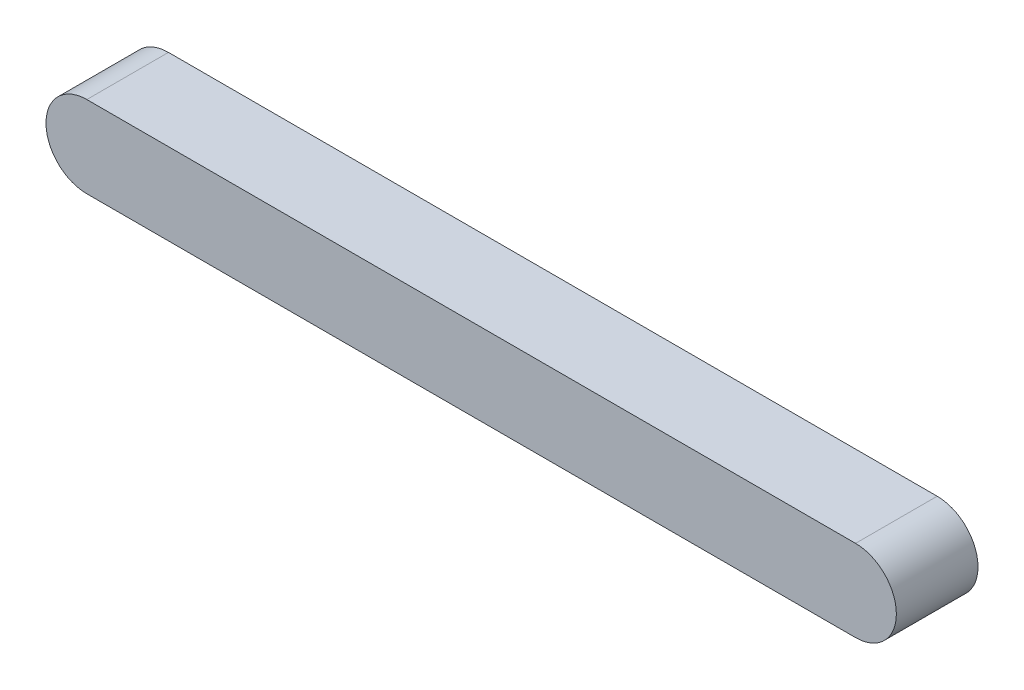
ISO-10303-21;
HEADER;
FILE_DESCRIPTION(('STEP AP214'),'2;1');
FILE_NAME('part.step','',(''),(''),'','','');
FILE_SCHEMA(('AUTOMOTIVE_DESIGN { 1 0 10303 214 1 1 1 1 }'));
ENDSEC;
DATA;
#1=APPLICATION_CONTEXT('core data for automotive mechanical design processes');
#2=APPLICATION_PROTOCOL_DEFINITION('international standard','automotive_design',2000,#1);
#3=PRODUCT_CONTEXT('',#1,'mechanical');
#4=PRODUCT('Part','Part','',(#3));
#5=PRODUCT_RELATED_PRODUCT_CATEGORY('part','',(#4));
#6=PRODUCT_DEFINITION_FORMATION('','',#4);
#7=PRODUCT_DEFINITION_CONTEXT('part definition',#1,'design');
#8=PRODUCT_DEFINITION('design','',#6,#7);
#9=PRODUCT_DEFINITION_SHAPE('','',#8);
#10=(LENGTH_UNIT() NAMED_UNIT(*) SI_UNIT(.MILLI.,.METRE.));
#11=(NAMED_UNIT(*) PLANE_ANGLE_UNIT() SI_UNIT($,.RADIAN.));
#12=(NAMED_UNIT(*) SI_UNIT($,.STERADIAN.) SOLID_ANGLE_UNIT());
#13=UNCERTAINTY_MEASURE_WITH_UNIT(LENGTH_MEASURE(1.E-05),#10,'distance_accuracy_value','');
#14=(GEOMETRIC_REPRESENTATION_CONTEXT(3) GLOBAL_UNCERTAINTY_ASSIGNED_CONTEXT((#13)) GLOBAL_UNIT_ASSIGNED_CONTEXT((#10,
#11,#12)) REPRESENTATION_CONTEXT('',''));
#15=CARTESIAN_POINT('',(0.,0.,0.));
#16=DIRECTION('',(0.,0.,1.));
#17=DIRECTION('',(1.,0.,0.));
#18=AXIS2_PLACEMENT_3D('',#15,#16,#17);
#19=CARTESIAN_POINT('',(-56.5,0.,12.));
#20=DIRECTION('',(0.,0.,-1.));
#21=DIRECTION('',(-1.,0.,0.));
#22=AXIS2_PLACEMENT_3D('',#19,#20,#21);
#23=CYLINDRICAL_SURFACE('',#22,5.99999999999996);
#24=CARTESIAN_POINT('',(-56.5,0.,0.));
#25=DIRECTION('',(0.,0.,1.));
#26=DIRECTION('',(1.,0.,0.));
#27=AXIS2_PLACEMENT_3D('',#24,#25,#26);
#28=CIRCLE('',#27,5.99999999999996);
#29=CARTESIAN_POINT('',(-56.5,5.99999999999996,0.));
#30=VERTEX_POINT('',#29);
#31=CARTESIAN_POINT('',(-56.5,-5.99999999999996,0.));
#32=VERTEX_POINT('',#31);
#33=EDGE_CURVE('E100',#30,#32,#28,.T.);
#34=ORIENTED_EDGE('',*,*,#33,.T.);
#35=DIRECTION('',(0.,0.,-1.));
#36=VECTOR('',#35,1.);
#37=CARTESIAN_POINT('',(-56.5,-5.99999999999996,12.));
#38=LINE('',#37,#36);
#39=CARTESIAN_POINT('',(-56.5,-5.99999999999996,12.));
#40=VERTEX_POINT('',#39);
#41=EDGE_CURVE('E11',#40,#32,#38,.T.);
#42=ORIENTED_EDGE('',*,*,#41,.F.);
#43=CARTESIAN_POINT('',(-56.5,0.,12.));
#44=DIRECTION('',(0.,0.,1.));
#45=DIRECTION('',(1.,0.,0.));
#46=AXIS2_PLACEMENT_3D('',#43,#44,#45);
#47=CIRCLE('',#46,5.99999999999996);
#48=CARTESIAN_POINT('',(-56.5,5.99999999999996,12.));
#49=VERTEX_POINT('',#48);
#50=EDGE_CURVE('E88',#49,#40,#47,.T.);
#51=ORIENTED_EDGE('',*,*,#50,.F.);
#52=DIRECTION('',(0.,0.,-1.));
#53=VECTOR('',#52,1.);
#54=CARTESIAN_POINT('',(-56.5,5.99999999999996,12.));
#55=LINE('',#54,#53);
#56=EDGE_CURVE('E96',#49,#30,#55,.T.);
#57=ORIENTED_EDGE('',*,*,#56,.T.);
#58=EDGE_LOOP('',(#34,#42,#51,#57));
#59=FACE_BOUND('',#58,.T.);
#60=ADVANCED_FACE('F37',(#59),#23,.T.);
#61=CARTESIAN_POINT('',(-56.5,-5.99999999999996,12.));
#62=DIRECTION('',(0.,1.,0.));
#63=DIRECTION('',(-1.,0.,0.));
#64=AXIS2_PLACEMENT_3D('',#61,#62,#63);
#65=PLANE('',#64);
#66=DIRECTION('',(1.,0.,0.));
#67=VECTOR('',#66,1.);
#68=CARTESIAN_POINT('',(-56.5,-5.99999999999996,0.));
#69=LINE('',#68,#67);
#70=CARTESIAN_POINT('',(56.5,-5.99999999999996,0.));
#71=VERTEX_POINT('',#70);
#72=EDGE_CURVE('E92',#32,#71,#69,.T.);
#73=ORIENTED_EDGE('',*,*,#72,.T.);
#74=DIRECTION('',(0.,0.,-1.));
#75=VECTOR('',#74,1.);
#76=CARTESIAN_POINT('',(56.5,-5.99999999999996,12.));
#77=LINE('',#76,#75);
#78=CARTESIAN_POINT('',(56.5,-5.99999999999996,12.));
#79=VERTEX_POINT('',#78);
#80=EDGE_CURVE('E45',#79,#71,#77,.T.);
#81=ORIENTED_EDGE('',*,*,#80,.F.);
#82=DIRECTION('',(1.,0.,0.));
#83=VECTOR('',#82,1.);
#84=CARTESIAN_POINT('',(-56.5,-5.99999999999996,12.));
#85=LINE('',#84,#83);
#86=EDGE_CURVE('E83',#40,#79,#85,.T.);
#87=ORIENTED_EDGE('',*,*,#86,.F.);
#88=ORIENTED_EDGE('',*,*,#41,.T.);
#89=EDGE_LOOP('',(#73,#81,#87,#88));
#90=FACE_BOUND('',#89,.T.);
#91=ADVANCED_FACE('F91',(#90),#65,.F.);
#92=CARTESIAN_POINT('',(56.5,0.,12.));
#93=DIRECTION('',(0.,0.,-1.));
#94=DIRECTION('',(-1.,0.,0.));
#95=AXIS2_PLACEMENT_3D('',#92,#93,#94);
#96=CYLINDRICAL_SURFACE('',#95,5.99999999999996);
#97=CARTESIAN_POINT('',(56.5,0.,0.));
#98=DIRECTION('',(0.,0.,1.));
#99=DIRECTION('',(1.,0.,0.));
#100=AXIS2_PLACEMENT_3D('',#97,#98,#99);
#101=CIRCLE('',#100,5.99999999999996);
#102=CARTESIAN_POINT('',(56.5,5.99999999999998,0.));
#103=VERTEX_POINT('',#102);
#104=EDGE_CURVE('E70',#71,#103,#101,.T.);
#105=ORIENTED_EDGE('',*,*,#104,.T.);
#106=DIRECTION('',(0.,0.,-1.));
#107=VECTOR('',#106,1.);
#108=CARTESIAN_POINT('',(56.5,5.99999999999998,12.));
#109=LINE('',#108,#107);
#110=CARTESIAN_POINT('',(56.5,5.99999999999998,12.));
#111=VERTEX_POINT('',#110);
#112=EDGE_CURVE('E93',#111,#103,#109,.T.);
#113=ORIENTED_EDGE('',*,*,#112,.F.);
#114=CARTESIAN_POINT('',(56.5,0.,12.));
#115=DIRECTION('',(0.,0.,1.));
#116=DIRECTION('',(1.,0.,0.));
#117=AXIS2_PLACEMENT_3D('',#114,#115,#116);
#118=CIRCLE('',#117,5.99999999999996);
#119=EDGE_CURVE('E86',#79,#111,#118,.T.);
#120=ORIENTED_EDGE('',*,*,#119,.F.);
#121=ORIENTED_EDGE('',*,*,#80,.T.);
#122=EDGE_LOOP('',(#105,#113,#120,#121));
#123=FACE_BOUND('',#122,.T.);
#124=ADVANCED_FACE('F94',(#123),#96,.T.);
#125=CARTESIAN_POINT('',(-56.5,5.99999999999996,12.));
#126=DIRECTION('',(0.,-1.,0.));
#127=DIRECTION('',(1.,0.,0.));
#128=AXIS2_PLACEMENT_3D('',#125,#126,#127);
#129=PLANE('',#128);
#130=DIRECTION('',(-1.,0.,0.));
#131=VECTOR('',#130,1.);
#132=CARTESIAN_POINT('',(-56.5,5.99999999999996,0.));
#133=LINE('',#132,#131);
#134=EDGE_CURVE('E76',#103,#30,#133,.T.);
#135=ORIENTED_EDGE('',*,*,#134,.T.);
#136=ORIENTED_EDGE('',*,*,#56,.F.);
#137=DIRECTION('',(-1.,0.,0.));
#138=VECTOR('',#137,1.);
#139=CARTESIAN_POINT('',(-56.5,5.99999999999996,12.));
#140=LINE('',#139,#138);
#141=EDGE_CURVE('E53',#111,#49,#140,.T.);
#142=ORIENTED_EDGE('',*,*,#141,.F.);
#143=ORIENTED_EDGE('',*,*,#112,.T.);
#144=EDGE_LOOP('',(#135,#136,#142,#143));
#145=FACE_BOUND('',#144,.T.);
#146=ADVANCED_FACE('F107',(#145),#129,.F.);
#147=CARTESIAN_POINT('',(-56.5,0.,12.));
#148=DIRECTION('',(0.,0.,1.));
#149=DIRECTION('',(1.,0.,0.));
#150=AXIS2_PLACEMENT_3D('',#147,#148,#149);
#151=PLANE('',#150);
#152=ORIENTED_EDGE('',*,*,#50,.T.);
#153=ORIENTED_EDGE('',*,*,#86,.T.);
#154=ORIENTED_EDGE('',*,*,#119,.T.);
#155=ORIENTED_EDGE('',*,*,#141,.T.);
#156=EDGE_LOOP('',(#152,#153,#154,#155));
#157=FACE_BOUND('',#156,.T.);
#158=ADVANCED_FACE('F84',(#157),#151,.T.);
#159=CARTESIAN_POINT('',(-56.5,0.,0.));
#160=DIRECTION('',(0.,0.,1.));
#161=DIRECTION('',(1.,0.,0.));
#162=AXIS2_PLACEMENT_3D('',#159,#160,#161);
#163=PLANE('',#162);
#164=ORIENTED_EDGE('',*,*,#33,.F.);
#165=ORIENTED_EDGE('',*,*,#134,.F.);
#166=ORIENTED_EDGE('',*,*,#104,.F.);
#167=ORIENTED_EDGE('',*,*,#72,.F.);
#168=EDGE_LOOP('',(#164,#165,#166,#167));
#169=FACE_BOUND('',#168,.T.);
#170=ADVANCED_FACE('F110',(#169),#163,.F.);
#171=CLOSED_SHELL('',(#60,#91,#124,#146,#158,#170));
#172=MANIFOLD_SOLID_BREP('B2',#171);
#173=ADVANCED_BREP_SHAPE_REPRESENTATION('',(#18,#172),#14);
#174=SHAPE_DEFINITION_REPRESENTATION(#9,#173);
ENDSEC;
END-ISO-10303-21;
